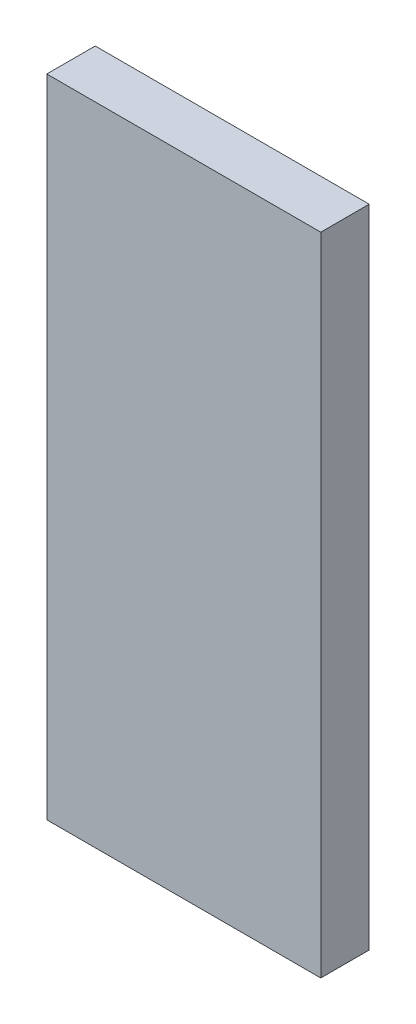
ISO-10303-21;
HEADER;
FILE_DESCRIPTION(('STEP AP214'),'2;1');
FILE_NAME('part.step','',(''),(''),'','','');
FILE_SCHEMA(('AUTOMOTIVE_DESIGN { 1 0 10303 214 1 1 1 1 }'));
ENDSEC;
DATA;
#1=APPLICATION_CONTEXT('core data for automotive mechanical design processes');
#2=APPLICATION_PROTOCOL_DEFINITION('international standard','automotive_design',2000,#1);
#3=PRODUCT_CONTEXT('',#1,'mechanical');
#4=PRODUCT('Part','Part','',(#3));
#5=PRODUCT_RELATED_PRODUCT_CATEGORY('part','',(#4));
#6=PRODUCT_DEFINITION_FORMATION('','',#4);
#7=PRODUCT_DEFINITION_CONTEXT('part definition',#1,'design');
#8=PRODUCT_DEFINITION('design','',#6,#7);
#9=PRODUCT_DEFINITION_SHAPE('','',#8);
#10=(LENGTH_UNIT() NAMED_UNIT(*) SI_UNIT(.MILLI.,.METRE.));
#11=(NAMED_UNIT(*) PLANE_ANGLE_UNIT() SI_UNIT($,.RADIAN.));
#12=(NAMED_UNIT(*) SI_UNIT($,.STERADIAN.) SOLID_ANGLE_UNIT());
#13=UNCERTAINTY_MEASURE_WITH_UNIT(LENGTH_MEASURE(1.E-05),#10,'distance_accuracy_value','');
#14=(GEOMETRIC_REPRESENTATION_CONTEXT(3) GLOBAL_UNCERTAINTY_ASSIGNED_CONTEXT((#13)) GLOBAL_UNIT_ASSIGNED_CONTEXT((#10,
#11,#12)) REPRESENTATION_CONTEXT('',''));
#15=CARTESIAN_POINT('',(0.,0.,0.));
#16=DIRECTION('',(0.,0.,1.));
#17=DIRECTION('',(1.,0.,0.));
#18=AXIS2_PLACEMENT_3D('',#15,#16,#17);
#19=CARTESIAN_POINT('',(4.2418,10.00000032,1.49999954));
#20=DIRECTION('',(0.,0.,-1.));
#21=DIRECTION('',(0.,-1.,0.));
#22=AXIS2_PLACEMENT_3D('',#19,#20,#21);
#23=PLANE('',#22);
#24=DIRECTION('',(-1.,0.,0.));
#25=VECTOR('',#24,1.);
#26=CARTESIAN_POINT('',(4.2418,10.00000032,1.49999954));
#27=LINE('',#26,#25);
#28=CARTESIAN_POINT('',(4.2418,10.00000032,1.49999954));
#29=VERTEX_POINT('',#28);
#30=CARTESIAN_POINT('',(-4.2418,10.00000032,1.49999954));
#31=VERTEX_POINT('',#30);
#32=EDGE_CURVE('E87',#29,#31,#27,.T.);
#33=ORIENTED_EDGE('',*,*,#32,.T.);
#34=DIRECTION('',(0.,-1.,0.));
#35=VECTOR('',#34,1.);
#36=CARTESIAN_POINT('',(-4.2418,10.00000032,1.49999954));
#37=LINE('',#36,#35);
#38=CARTESIAN_POINT('',(-4.2418,-10.00000032,1.49999954));
#39=VERTEX_POINT('',#38);
#40=EDGE_CURVE('E82',#31,#39,#37,.T.);
#41=ORIENTED_EDGE('',*,*,#40,.T.);
#42=DIRECTION('',(1.,0.,0.));
#43=VECTOR('',#42,1.);
#44=CARTESIAN_POINT('',(-4.2418,-10.00000032,1.49999954));
#45=LINE('',#44,#43);
#46=CARTESIAN_POINT('',(4.2418,-10.00000032,1.49999954));
#47=VERTEX_POINT('',#46);
#48=EDGE_CURVE('E104',#39,#47,#45,.T.);
#49=ORIENTED_EDGE('',*,*,#48,.T.);
#50=DIRECTION('',(0.,1.,0.));
#51=VECTOR('',#50,1.);
#52=CARTESIAN_POINT('',(4.2418,-10.00000032,1.49999954));
#53=LINE('',#52,#51);
#54=EDGE_CURVE('E11',#47,#29,#53,.T.);
#55=ORIENTED_EDGE('',*,*,#54,.T.);
#56=EDGE_LOOP('',(#33,#41,#49,#55));
#57=FACE_BOUND('',#56,.T.);
#58=ADVANCED_FACE('F16',(#57),#23,.F.);
#59=CARTESIAN_POINT('',(4.2418,10.00000032,0.));
#60=DIRECTION('',(0.,0.,-1.));
#61=DIRECTION('',(0.,-1.,0.));
#62=AXIS2_PLACEMENT_3D('',#59,#60,#61);
#63=PLANE('',#62);
#64=DIRECTION('',(0.,1.,0.));
#65=VECTOR('',#64,1.);
#66=CARTESIAN_POINT('',(4.2418,-10.00000032,0.));
#67=LINE('',#66,#65);
#68=CARTESIAN_POINT('',(4.2418,-10.00000032,0.));
#69=VERTEX_POINT('',#68);
#70=CARTESIAN_POINT('',(4.2418,10.00000032,0.));
#71=VERTEX_POINT('',#70);
#72=EDGE_CURVE('E26',#69,#71,#67,.T.);
#73=ORIENTED_EDGE('',*,*,#72,.F.);
#74=DIRECTION('',(1.,0.,0.));
#75=VECTOR('',#74,1.);
#76=CARTESIAN_POINT('',(-4.2418,-10.00000032,0.));
#77=LINE('',#76,#75);
#78=CARTESIAN_POINT('',(-4.2418,-10.00000032,0.));
#79=VERTEX_POINT('',#78);
#80=EDGE_CURVE('E70',#79,#69,#77,.T.);
#81=ORIENTED_EDGE('',*,*,#80,.F.);
#82=DIRECTION('',(0.,-1.,0.));
#83=VECTOR('',#82,1.);
#84=CARTESIAN_POINT('',(-4.2418,10.00000032,0.));
#85=LINE('',#84,#83);
#86=CARTESIAN_POINT('',(-4.2418,10.00000032,0.));
#87=VERTEX_POINT('',#86);
#88=EDGE_CURVE('E65',#87,#79,#85,.T.);
#89=ORIENTED_EDGE('',*,*,#88,.F.);
#90=DIRECTION('',(-1.,0.,0.));
#91=VECTOR('',#90,1.);
#92=CARTESIAN_POINT('',(4.2418,10.00000032,0.));
#93=LINE('',#92,#91);
#94=EDGE_CURVE('E68',#71,#87,#93,.T.);
#95=ORIENTED_EDGE('',*,*,#94,.F.);
#96=EDGE_LOOP('',(#73,#81,#89,#95));
#97=FACE_BOUND('',#96,.T.);
#98=ADVANCED_FACE('F18',(#97),#63,.T.);
#99=CARTESIAN_POINT('',(4.2418,-10.00000032,0.));
#100=DIRECTION('',(-1.,0.,0.));
#101=DIRECTION('',(0.,0.,1.));
#102=AXIS2_PLACEMENT_3D('',#99,#100,#101);
#103=PLANE('',#102);
#104=ORIENTED_EDGE('',*,*,#72,.T.);
#105=DIRECTION('',(0.,0.,1.));
#106=VECTOR('',#105,1.);
#107=CARTESIAN_POINT('',(4.2418,10.00000032,0.));
#108=LINE('',#107,#106);
#109=EDGE_CURVE('E76',#71,#29,#108,.T.);
#110=ORIENTED_EDGE('',*,*,#109,.T.);
#111=ORIENTED_EDGE('',*,*,#54,.F.);
#112=DIRECTION('',(0.,0.,1.));
#113=VECTOR('',#112,1.);
#114=CARTESIAN_POINT('',(4.2418,-10.00000032,0.));
#115=LINE('',#114,#113);
#116=EDGE_CURVE('E100',#69,#47,#115,.T.);
#117=ORIENTED_EDGE('',*,*,#116,.F.);
#118=EDGE_LOOP('',(#104,#110,#111,#117));
#119=FACE_BOUND('',#118,.T.);
#120=ADVANCED_FACE('F173',(#119),#103,.F.);
#121=CARTESIAN_POINT('',(-4.2418,-10.00000032,0.));
#122=DIRECTION('',(0.,1.,0.));
#123=DIRECTION('',(1.,0.,0.));
#124=AXIS2_PLACEMENT_3D('',#121,#122,#123);
#125=PLANE('',#124);
#126=ORIENTED_EDGE('',*,*,#80,.T.);
#127=ORIENTED_EDGE('',*,*,#116,.T.);
#128=ORIENTED_EDGE('',*,*,#48,.F.);
#129=DIRECTION('',(0.,0.,1.));
#130=VECTOR('',#129,1.);
#131=CARTESIAN_POINT('',(-4.2418,-10.00000032,0.));
#132=LINE('',#131,#130);
#133=EDGE_CURVE('E75',#79,#39,#132,.T.);
#134=ORIENTED_EDGE('',*,*,#133,.F.);
#135=EDGE_LOOP('',(#126,#127,#128,#134));
#136=FACE_BOUND('',#135,.T.);
#137=ADVANCED_FACE('F171',(#136),#125,.F.);
#138=CARTESIAN_POINT('',(-4.2418,10.00000032,0.));
#139=DIRECTION('',(1.,0.,0.));
#140=DIRECTION('',(0.,1.,0.));
#141=AXIS2_PLACEMENT_3D('',#138,#139,#140);
#142=PLANE('',#141);
#143=ORIENTED_EDGE('',*,*,#88,.T.);
#144=ORIENTED_EDGE('',*,*,#133,.T.);
#145=ORIENTED_EDGE('',*,*,#40,.F.);
#146=DIRECTION('',(0.,0.,1.));
#147=VECTOR('',#146,1.);
#148=CARTESIAN_POINT('',(-4.2418,10.00000032,0.));
#149=LINE('',#148,#147);
#150=EDGE_CURVE('E79',#87,#31,#149,.T.);
#151=ORIENTED_EDGE('',*,*,#150,.F.);
#152=EDGE_LOOP('',(#143,#144,#145,#151));
#153=FACE_BOUND('',#152,.T.);
#154=ADVANCED_FACE('F80',(#153),#142,.F.);
#155=CARTESIAN_POINT('',(4.2418,10.00000032,0.));
#156=DIRECTION('',(0.,-1.,0.));
#157=DIRECTION('',(0.,0.,-1.));
#158=AXIS2_PLACEMENT_3D('',#155,#156,#157);
#159=PLANE('',#158);
#160=ORIENTED_EDGE('',*,*,#94,.T.);
#161=ORIENTED_EDGE('',*,*,#150,.T.);
#162=ORIENTED_EDGE('',*,*,#32,.F.);
#163=ORIENTED_EDGE('',*,*,#109,.F.);
#164=EDGE_LOOP('',(#160,#161,#162,#163));
#165=FACE_BOUND('',#164,.T.);
#166=ADVANCED_FACE('F90',(#165),#159,.F.);
#167=CLOSED_SHELL('',(#58,#98,#120,#137,#154,#166));
#168=MANIFOLD_SOLID_BREP('B1',#167);
#169=ADVANCED_BREP_SHAPE_REPRESENTATION('',(#18,#168),#14);
#170=SHAPE_DEFINITION_REPRESENTATION(#9,#169);
ENDSEC;
END-ISO-10303-21;
